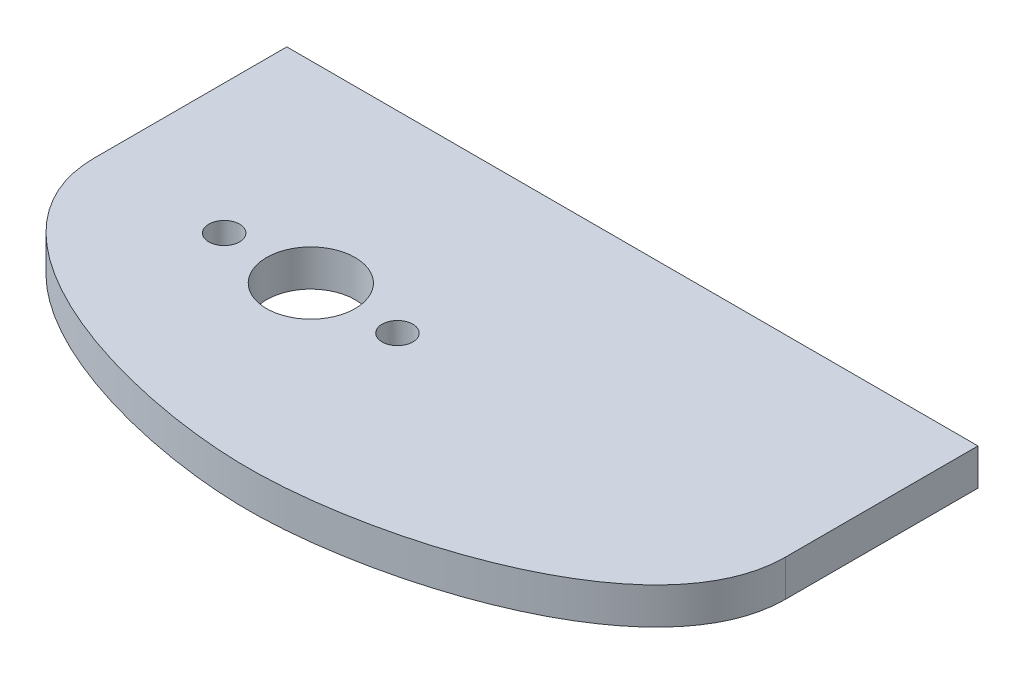
ISO-10303-21;
HEADER;
FILE_DESCRIPTION(('STEP AP214'),'2;1');
FILE_NAME('part.step','',(''),(''),'','','');
FILE_SCHEMA(('AUTOMOTIVE_DESIGN { 1 0 10303 214 1 1 1 1 }'));
ENDSEC;
DATA;
#1=APPLICATION_CONTEXT('core data for automotive mechanical design processes');
#2=APPLICATION_PROTOCOL_DEFINITION('international standard','automotive_design',2000,#1);
#3=PRODUCT_CONTEXT('',#1,'mechanical');
#4=PRODUCT('Part','Part','',(#3));
#5=PRODUCT_RELATED_PRODUCT_CATEGORY('part','',(#4));
#6=PRODUCT_DEFINITION_FORMATION('','',#4);
#7=PRODUCT_DEFINITION_CONTEXT('part definition',#1,'design');
#8=PRODUCT_DEFINITION('design','',#6,#7);
#9=PRODUCT_DEFINITION_SHAPE('','',#8);
#10=(LENGTH_UNIT() NAMED_UNIT(*) SI_UNIT(.MILLI.,.METRE.));
#11=(NAMED_UNIT(*) PLANE_ANGLE_UNIT() SI_UNIT($,.RADIAN.));
#12=(NAMED_UNIT(*) SI_UNIT($,.STERADIAN.) SOLID_ANGLE_UNIT());
#13=UNCERTAINTY_MEASURE_WITH_UNIT(LENGTH_MEASURE(1.E-05),#10,'distance_accuracy_value','');
#14=(GEOMETRIC_REPRESENTATION_CONTEXT(3) GLOBAL_UNCERTAINTY_ASSIGNED_CONTEXT((#13)) GLOBAL_UNIT_ASSIGNED_CONTEXT((#10,
#11,#12)) REPRESENTATION_CONTEXT('',''));
#15=CARTESIAN_POINT('',(0.,0.,0.));
#16=DIRECTION('',(0.,0.,1.));
#17=DIRECTION('',(1.,0.,0.));
#18=AXIS2_PLACEMENT_3D('',#15,#16,#17);
#19=CARTESIAN_POINT('',(-17.4968900599969,1.9,0.));
#20=DIRECTION('',(1.,0.,0.));
#21=DIRECTION('',(0.,0.,-1.));
#22=AXIS2_PLACEMENT_3D('',#19,#20,#21);
#23=PLANE('',#22);
#24=DIRECTION('',(0.,0.,1.));
#25=VECTOR('',#24,1.);
#26=CARTESIAN_POINT('',(-17.4968900599969,0.,0.));
#27=LINE('',#26,#25);
#28=CARTESIAN_POINT('',(-17.4968900599969,0.,-10.2267978635951));
#29=VERTEX_POINT('',#28);
#30=CARTESIAN_POINT('',(-17.4968900599969,0.,-0.226797863595054));
#31=VERTEX_POINT('',#30);
#32=EDGE_CURVE('E113',#29,#31,#27,.T.);
#33=ORIENTED_EDGE('',*,*,#32,.T.);
#34=DIRECTION('',(0.,-1.,0.));
#35=VECTOR('',#34,1.);
#36=CARTESIAN_POINT('',(-17.4968900599969,1.9,-0.226797863595054));
#37=LINE('',#36,#35);
#38=CARTESIAN_POINT('',(-17.4968900599969,1.9,-0.226797863595054));
#39=VERTEX_POINT('',#38);
#40=EDGE_CURVE('E11',#39,#31,#37,.T.);
#41=ORIENTED_EDGE('',*,*,#40,.F.);
#42=DIRECTION('',(0.,0.,1.));
#43=VECTOR('',#42,1.);
#44=CARTESIAN_POINT('',(-17.4968900599969,1.9,0.));
#45=LINE('',#44,#43);
#46=CARTESIAN_POINT('',(-17.4968900599969,1.9,-10.2267978635951));
#47=VERTEX_POINT('',#46);
#48=EDGE_CURVE('E86',#47,#39,#45,.T.);
#49=ORIENTED_EDGE('',*,*,#48,.F.);
#50=DIRECTION('',(0.,-1.,0.));
#51=VECTOR('',#50,1.);
#52=CARTESIAN_POINT('',(-17.4968900599969,1.9,-10.2267978635951));
#53=LINE('',#52,#51);
#54=EDGE_CURVE('E97',#47,#29,#53,.T.);
#55=ORIENTED_EDGE('',*,*,#54,.T.);
#56=EDGE_LOOP('',(#33,#41,#49,#55));
#57=FACE_BOUND('',#56,.T.);
#58=ADVANCED_FACE('F38',(#57),#23,.F.);
#59=CARTESIAN_POINT('',(-17.4968900599969,1.9,-0.226797863595054));
#60=CARTESIAN_POINT('',(-17.4968900599969,1.9,6.43986880307163));
#61=CARTESIAN_POINT('',(-6.21355672666352,1.9,9.72320213640494));
#62=CARTESIAN_POINT('',(7.11977660666981,1.9,9.72320213640494));
#63=CARTESIAN_POINT('',(18.4031099400037,1.9,6.43986880307182));
#64=CARTESIAN_POINT('',(18.4031099400031,1.9,-0.226797863595066));
#65=B_SPLINE_CURVE_WITH_KNOTS('',3,(#59,#60,#61,#62,#63,#64),.UNSPECIFIED.,.F.,.F.,(4,2,4),(0.,
0.5,1.),.UNSPECIFIED.);
#66=DIRECTION('',(0.,-1.,0.));
#67=VECTOR('',#66,1.);
#68=SURFACE_OF_LINEAR_EXTRUSION('',#65,#67);
#69=CARTESIAN_POINT('',(-17.4968900599969,0.,-0.226797863595054));
#70=CARTESIAN_POINT('',(-17.4968900599969,0.,6.43986880307163));
#71=CARTESIAN_POINT('',(-6.21355672666352,0.,9.72320213640494));
#72=CARTESIAN_POINT('',(7.11977660666981,0.,9.72320213640494));
#73=CARTESIAN_POINT('',(18.4031099400037,0.,6.43986880307182));
#74=CARTESIAN_POINT('',(18.4031099400031,0.,-0.226797863595066));
#75=B_SPLINE_CURVE_WITH_KNOTS('',3,(#69,#70,#71,#72,#73,#74),.UNSPECIFIED.,.F.,.F.,(4,2,4),(0.,
0.5,1.),.UNSPECIFIED.);
#76=CARTESIAN_POINT('',(18.4031099400031,0.,-0.226797863595066));
#77=VERTEX_POINT('',#76);
#78=EDGE_CURVE('E91',#31,#77,#75,.T.);
#79=ORIENTED_EDGE('',*,*,#78,.T.);
#80=DIRECTION('',(0.,-1.,0.));
#81=VECTOR('',#80,1.);
#82=CARTESIAN_POINT('',(18.4031099400031,1.9,-0.226797863595066));
#83=LINE('',#82,#81);
#84=CARTESIAN_POINT('',(18.4031099400031,1.9,-0.226797863595066));
#85=VERTEX_POINT('',#84);
#86=EDGE_CURVE('E47',#85,#77,#83,.T.);
#87=ORIENTED_EDGE('',*,*,#86,.F.);
#88=EDGE_CURVE('E81',#39,#85,#65,.T.);
#89=ORIENTED_EDGE('',*,*,#88,.F.);
#90=ORIENTED_EDGE('',*,*,#40,.T.);
#91=EDGE_LOOP('',(#79,#87,#89,#90));
#92=FACE_BOUND('',#91,.T.);
#93=ADVANCED_FACE('F90',(#92),#68,.F.);
#94=CARTESIAN_POINT('',(18.4031099400031,1.9,0.));
#95=DIRECTION('',(1.,0.,0.));
#96=DIRECTION('',(0.,0.,-1.));
#97=AXIS2_PLACEMENT_3D('',#94,#95,#96);
#98=PLANE('',#97);
#99=DIRECTION('',(0.,0.,1.));
#100=VECTOR('',#99,1.);
#101=CARTESIAN_POINT('',(18.4031099400031,0.,0.));
#102=LINE('',#101,#100);
#103=CARTESIAN_POINT('',(18.4031099400031,0.,-10.2267978635951));
#104=VERTEX_POINT('',#103);
#105=EDGE_CURVE('E119',#104,#77,#102,.T.);
#106=ORIENTED_EDGE('',*,*,#105,.F.);
#107=DIRECTION('',(0.,-1.,0.));
#108=VECTOR('',#107,1.);
#109=CARTESIAN_POINT('',(18.4031099400031,1.9,-10.2267978635951));
#110=LINE('',#109,#108);
#111=CARTESIAN_POINT('',(18.4031099400031,1.9,-10.2267978635951));
#112=VERTEX_POINT('',#111);
#113=EDGE_CURVE('E71',#112,#104,#110,.T.);
#114=ORIENTED_EDGE('',*,*,#113,.F.);
#115=DIRECTION('',(0.,0.,1.));
#116=VECTOR('',#115,1.);
#117=CARTESIAN_POINT('',(18.4031099400031,1.9,0.));
#118=LINE('',#117,#116);
#119=EDGE_CURVE('E84',#112,#85,#118,.T.);
#120=ORIENTED_EDGE('',*,*,#119,.T.);
#121=ORIENTED_EDGE('',*,*,#86,.T.);
#122=EDGE_LOOP('',(#106,#114,#120,#121));
#123=FACE_BOUND('',#122,.T.);
#124=ADVANCED_FACE('F95',(#123),#98,.T.);
#125=CARTESIAN_POINT('',(-6.25,1.9,-0.226797863595056));
#126=DIRECTION('',(0.,-1.,0.));
#127=DIRECTION('',(0.,0.,-1.));
#128=AXIS2_PLACEMENT_3D('',#125,#126,#127);
#129=CYLINDRICAL_SURFACE('',#128,2.3);
#130=CARTESIAN_POINT('',(-6.25,1.9,-0.226797863595056));
#131=DIRECTION('',(0.,1.,0.));
#132=DIRECTION('',(0.,0.,1.));
#133=AXIS2_PLACEMENT_3D('',#130,#131,#132);
#134=CIRCLE('',#133,2.3);
#135=CARTESIAN_POINT('',(-6.25,1.9,-2.52679786359506));
#136=VERTEX_POINT('',#135);
#137=EDGE_CURVE('E169',#136,#136,#134,.T.);
#138=CARTESIAN_POINT('',(-6.25,0.,-0.226797863595056));
#139=DIRECTION('',(0.,1.,0.));
#140=DIRECTION('',(0.,0.,1.));
#141=AXIS2_PLACEMENT_3D('',#138,#139,#140);
#142=CIRCLE('',#141,2.3);
#143=CARTESIAN_POINT('',(-6.25,0.,-2.52679786359506));
#144=VERTEX_POINT('',#143);
#145=EDGE_CURVE('E110',#144,#144,#142,.T.);
#146=CARTESIAN_POINT('',(-6.25,1.9,-2.52679786359506));
#147=CARTESIAN_POINT('',(-6.25,1.88020833333333,-2.52679786359506));
#148=CARTESIAN_POINT('',(-6.25,1.86041666666667,-2.52679786359506));
#149=CARTESIAN_POINT('',(-6.25,1.82083333333333,-2.52679786359506));
#150=CARTESIAN_POINT('',(-6.25,1.80104166666667,-2.52679786359506));
#151=CARTESIAN_POINT('',(-6.25,1.76145833333333,-2.52679786359506));
#152=CARTESIAN_POINT('',(-6.25,1.74166666666667,-2.52679786359506));
#153=CARTESIAN_POINT('',(-6.25,1.70208333333333,-2.52679786359506));
#154=CARTESIAN_POINT('',(-6.25,1.68229166666667,-2.52679786359506));
#155=CARTESIAN_POINT('',(-6.25,1.64270833333333,-2.52679786359506));
#156=CARTESIAN_POINT('',(-6.25,1.62291666666667,-2.52679786359506));
#157=CARTESIAN_POINT('',(-6.25,1.58333333333333,-2.52679786359506));
#158=CARTESIAN_POINT('',(-6.25,1.56354166666667,-2.52679786359506));
#159=CARTESIAN_POINT('',(-6.25,1.52395833333333,-2.52679786359506));
#160=CARTESIAN_POINT('',(-6.25,1.50416666666667,-2.52679786359506));
#161=CARTESIAN_POINT('',(-6.25,1.46458333333333,-2.52679786359506));
#162=CARTESIAN_POINT('',(-6.25,1.44479166666667,-2.52679786359506));
#163=CARTESIAN_POINT('',(-6.25,1.40520833333333,-2.52679786359506));
#164=CARTESIAN_POINT('',(-6.25,1.38541666666667,-2.52679786359506));
#165=CARTESIAN_POINT('',(-6.25,1.34583333333333,-2.52679786359506));
#166=CARTESIAN_POINT('',(-6.25,1.32604166666667,-2.52679786359506));
#167=CARTESIAN_POINT('',(-6.25,1.28645833333333,-2.52679786359506));
#168=CARTESIAN_POINT('',(-6.25,1.26666666666667,-2.52679786359506));
#169=CARTESIAN_POINT('',(-6.25,1.22708333333333,-2.52679786359506));
#170=CARTESIAN_POINT('',(-6.25,1.20729166666667,-2.52679786359506));
#171=CARTESIAN_POINT('',(-6.25,1.16770833333333,-2.52679786359506));
#172=CARTESIAN_POINT('',(-6.25,1.14791666666667,-2.52679786359506));
#173=CARTESIAN_POINT('',(-6.25,1.10833333333333,-2.52679786359506));
#174=CARTESIAN_POINT('',(-6.25,1.08854166666667,-2.52679786359506));
#175=CARTESIAN_POINT('',(-6.25,1.04895833333333,-2.52679786359506));
#176=CARTESIAN_POINT('',(-6.25,1.02916666666667,-2.52679786359506));
#177=CARTESIAN_POINT('',(-6.25,0.989583333333333,-2.52679786359506));
#178=CARTESIAN_POINT('',(-6.25,0.969791666666666,-2.52679786359506));
#179=CARTESIAN_POINT('',(-6.25,0.930208333333333,-2.52679786359506));
#180=CARTESIAN_POINT('',(-6.25,0.910416666666667,-2.52679786359506));
#181=CARTESIAN_POINT('',(-6.25,0.870833333333333,-2.52679786359506));
#182=CARTESIAN_POINT('',(-6.25,0.851041666666667,-2.52679786359506));
#183=CARTESIAN_POINT('',(-6.25,0.811458333333333,-2.52679786359506));
#184=CARTESIAN_POINT('',(-6.25,0.791666666666667,-2.52679786359506));
#185=CARTESIAN_POINT('',(-6.25,0.752083333333333,-2.52679786359506));
#186=CARTESIAN_POINT('',(-6.25,0.732291666666667,-2.52679786359506));
#187=CARTESIAN_POINT('',(-6.25,0.692708333333333,-2.52679786359506));
#188=CARTESIAN_POINT('',(-6.25,0.672916666666667,-2.52679786359506));
#189=CARTESIAN_POINT('',(-6.25,0.633333333333333,-2.52679786359506));
#190=CARTESIAN_POINT('',(-6.25,0.613541666666667,-2.52679786359506));
#191=CARTESIAN_POINT('',(-6.25,0.573958333333333,-2.52679786359506));
#192=CARTESIAN_POINT('',(-6.25,0.554166666666667,-2.52679786359506));
#193=CARTESIAN_POINT('',(-6.25,0.514583333333334,-2.52679786359506));
#194=CARTESIAN_POINT('',(-6.25,0.494791666666667,-2.52679786359506));
#195=CARTESIAN_POINT('',(-6.25,0.455208333333333,-2.52679786359506));
#196=CARTESIAN_POINT('',(-6.25,0.435416666666667,-2.52679786359506));
#197=CARTESIAN_POINT('',(-6.25,0.395833333333333,-2.52679786359506));
#198=CARTESIAN_POINT('',(-6.25,0.376041666666667,-2.52679786359506));
#199=CARTESIAN_POINT('',(-6.25,0.336458333333333,-2.52679786359506));
#200=CARTESIAN_POINT('',(-6.25,0.316666666666667,-2.52679786359506));
#201=CARTESIAN_POINT('',(-6.25,0.277083333333333,-2.52679786359506));
#202=CARTESIAN_POINT('',(-6.25,0.257291666666667,-2.52679786359506));
#203=CARTESIAN_POINT('',(-6.25,0.217708333333333,-2.52679786359506));
#204=CARTESIAN_POINT('',(-6.25,0.197916666666667,-2.52679786359506));
#205=CARTESIAN_POINT('',(-6.25,0.158333333333333,-2.52679786359506));
#206=CARTESIAN_POINT('',(-6.25,0.138541666666667,-2.52679786359506));
#207=CARTESIAN_POINT('',(-6.25,0.0989583333333333,-2.52679786359506));
#208=CARTESIAN_POINT('',(-6.25,0.0791666666666666,-2.52679786359506));
#209=CARTESIAN_POINT('',(-6.25,0.0395833333333333,-2.52679786359506));
#210=CARTESIAN_POINT('',(-6.25,0.0197916666666666,-2.52679786359506));
#211=CARTESIAN_POINT('',(-6.25,0.,-2.52679786359506));
#212=B_SPLINE_CURVE_WITH_KNOTS('',3,(#146,#147,#148,#149,#150,#151,#152,#153,#154,#155,#156,
#157,#158,#159,#160,#161,#162,#163,#164,#165,#166,#167,#168,#169,#170,#171,#172,#173,#174,#175,
#176,#177,#178,#179,#180,#181,#182,#183,#184,#185,#186,#187,#188,#189,#190,#191,#192,#193,#194,
#195,#196,#197,#198,#199,#200,#201,#202,#203,#204,#205,#206,#207,#208,#209,#210,#211),
.UNSPECIFIED.,.F.,.F.,(4,2,2,2,2,2,2,2,2,2,2,2,2,2,2,2,2,2,2,2,2,2,2,2,2,2,2,2,2,2,2,2,4),(0.,
0.0593750000000002,0.11875,0.178125,0.2375,0.296875,0.35625,0.415625,0.475,0.534375,0.59375,
0.653125,0.7125,0.771875,0.83125,0.890625,0.95,1.009375,1.06875,1.128125,1.1875,1.246875,
1.30625,1.365625,1.425,1.484375,1.54375,1.603125,1.6625,1.721875,1.78125,1.840625,1.9),.UNSPECIFIED.);
#213=EDGE_CURVE('BSEAM150',#136,#144,#212,.T.);
#214=ORIENTED_EDGE('',*,*,#137,.T.);
#215=ORIENTED_EDGE('',*,*,#145,.F.);
#216=ORIENTED_EDGE('',*,*,#213,.T.);
#217=ORIENTED_EDGE('',*,*,#213,.F.);
#218=EDGE_LOOP('',(#214,#216,#215,#217));
#219=FACE_BOUND('',#218,.T.);
#220=ADVANCED_FACE('F150',(#219),#129,.F.);
#221=CARTESIAN_POINT('',(-10.75,1.9,-0.226797863595056));
#222=DIRECTION('',(0.,-1.,0.));
#223=DIRECTION('',(0.,0.,-1.));
#224=AXIS2_PLACEMENT_3D('',#221,#222,#223);
#225=CYLINDRICAL_SURFACE('',#224,0.800000000000001);
#226=CARTESIAN_POINT('',(-10.75,1.9,-0.226797863595056));
#227=DIRECTION('',(0.,1.,0.));
#228=DIRECTION('',(0.,0.,1.));
#229=AXIS2_PLACEMENT_3D('',#226,#227,#228);
#230=CIRCLE('',#229,0.800000000000001);
#231=CARTESIAN_POINT('',(-10.75,1.9,-1.02679786359506));
#232=VERTEX_POINT('',#231);
#233=EDGE_CURVE('E163',#232,#232,#230,.T.);
#234=CARTESIAN_POINT('',(-10.75,0.,-0.226797863595056));
#235=DIRECTION('',(0.,1.,0.));
#236=DIRECTION('',(0.,0.,1.));
#237=AXIS2_PLACEMENT_3D('',#234,#235,#236);
#238=CIRCLE('',#237,0.800000000000001);
#239=CARTESIAN_POINT('',(-10.75,0.,-1.02679786359506));
#240=VERTEX_POINT('',#239);
#241=EDGE_CURVE('E107',#240,#240,#238,.T.);
#242=CARTESIAN_POINT('',(-10.75,1.9,-1.02679786359506));
#243=CARTESIAN_POINT('',(-10.75,1.88020833333333,-1.02679786359506));
#244=CARTESIAN_POINT('',(-10.75,1.86041666666667,-1.02679786359506));
#245=CARTESIAN_POINT('',(-10.75,1.82083333333333,-1.02679786359506));
#246=CARTESIAN_POINT('',(-10.75,1.80104166666667,-1.02679786359506));
#247=CARTESIAN_POINT('',(-10.75,1.76145833333333,-1.02679786359506));
#248=CARTESIAN_POINT('',(-10.75,1.74166666666667,-1.02679786359506));
#249=CARTESIAN_POINT('',(-10.75,1.70208333333333,-1.02679786359506));
#250=CARTESIAN_POINT('',(-10.75,1.68229166666667,-1.02679786359506));
#251=CARTESIAN_POINT('',(-10.75,1.64270833333333,-1.02679786359506));
#252=CARTESIAN_POINT('',(-10.75,1.62291666666667,-1.02679786359506));
#253=CARTESIAN_POINT('',(-10.75,1.58333333333333,-1.02679786359506));
#254=CARTESIAN_POINT('',(-10.75,1.56354166666667,-1.02679786359506));
#255=CARTESIAN_POINT('',(-10.75,1.52395833333333,-1.02679786359506));
#256=CARTESIAN_POINT('',(-10.75,1.50416666666667,-1.02679786359506));
#257=CARTESIAN_POINT('',(-10.75,1.46458333333333,-1.02679786359506));
#258=CARTESIAN_POINT('',(-10.75,1.44479166666667,-1.02679786359506));
#259=CARTESIAN_POINT('',(-10.75,1.40520833333333,-1.02679786359506));
#260=CARTESIAN_POINT('',(-10.75,1.38541666666667,-1.02679786359506));
#261=CARTESIAN_POINT('',(-10.75,1.34583333333333,-1.02679786359506));
#262=CARTESIAN_POINT('',(-10.75,1.32604166666667,-1.02679786359506));
#263=CARTESIAN_POINT('',(-10.75,1.28645833333333,-1.02679786359506));
#264=CARTESIAN_POINT('',(-10.75,1.26666666666667,-1.02679786359506));
#265=CARTESIAN_POINT('',(-10.75,1.22708333333333,-1.02679786359506));
#266=CARTESIAN_POINT('',(-10.75,1.20729166666667,-1.02679786359506));
#267=CARTESIAN_POINT('',(-10.75,1.16770833333333,-1.02679786359506));
#268=CARTESIAN_POINT('',(-10.75,1.14791666666667,-1.02679786359506));
#269=CARTESIAN_POINT('',(-10.75,1.10833333333333,-1.02679786359506));
#270=CARTESIAN_POINT('',(-10.75,1.08854166666667,-1.02679786359506));
#271=CARTESIAN_POINT('',(-10.75,1.04895833333333,-1.02679786359506));
#272=CARTESIAN_POINT('',(-10.75,1.02916666666667,-1.02679786359506));
#273=CARTESIAN_POINT('',(-10.75,0.989583333333333,-1.02679786359506));
#274=CARTESIAN_POINT('',(-10.75,0.969791666666666,-1.02679786359506));
#275=CARTESIAN_POINT('',(-10.75,0.930208333333333,-1.02679786359506));
#276=CARTESIAN_POINT('',(-10.75,0.910416666666667,-1.02679786359506));
#277=CARTESIAN_POINT('',(-10.75,0.870833333333333,-1.02679786359506));
#278=CARTESIAN_POINT('',(-10.75,0.851041666666667,-1.02679786359506));
#279=CARTESIAN_POINT('',(-10.75,0.811458333333333,-1.02679786359506));
#280=CARTESIAN_POINT('',(-10.75,0.791666666666667,-1.02679786359506));
#281=CARTESIAN_POINT('',(-10.75,0.752083333333333,-1.02679786359506));
#282=CARTESIAN_POINT('',(-10.75,0.732291666666667,-1.02679786359506));
#283=CARTESIAN_POINT('',(-10.75,0.692708333333333,-1.02679786359506));
#284=CARTESIAN_POINT('',(-10.75,0.672916666666667,-1.02679786359506));
#285=CARTESIAN_POINT('',(-10.75,0.633333333333333,-1.02679786359506));
#286=CARTESIAN_POINT('',(-10.75,0.613541666666667,-1.02679786359506));
#287=CARTESIAN_POINT('',(-10.75,0.573958333333333,-1.02679786359506));
#288=CARTESIAN_POINT('',(-10.75,0.554166666666667,-1.02679786359506));
#289=CARTESIAN_POINT('',(-10.75,0.514583333333334,-1.02679786359506));
#290=CARTESIAN_POINT('',(-10.75,0.494791666666667,-1.02679786359506));
#291=CARTESIAN_POINT('',(-10.75,0.455208333333333,-1.02679786359506));
#292=CARTESIAN_POINT('',(-10.75,0.435416666666667,-1.02679786359506));
#293=CARTESIAN_POINT('',(-10.75,0.395833333333333,-1.02679786359506));
#294=CARTESIAN_POINT('',(-10.75,0.376041666666667,-1.02679786359506));
#295=CARTESIAN_POINT('',(-10.75,0.336458333333333,-1.02679786359506));
#296=CARTESIAN_POINT('',(-10.75,0.316666666666667,-1.02679786359506));
#297=CARTESIAN_POINT('',(-10.75,0.277083333333333,-1.02679786359506));
#298=CARTESIAN_POINT('',(-10.75,0.257291666666667,-1.02679786359506));
#299=CARTESIAN_POINT('',(-10.75,0.217708333333333,-1.02679786359506));
#300=CARTESIAN_POINT('',(-10.75,0.197916666666667,-1.02679786359506));
#301=CARTESIAN_POINT('',(-10.75,0.158333333333333,-1.02679786359506));
#302=CARTESIAN_POINT('',(-10.75,0.138541666666667,-1.02679786359506));
#303=CARTESIAN_POINT('',(-10.75,0.0989583333333333,-1.02679786359506));
#304=CARTESIAN_POINT('',(-10.75,0.0791666666666666,-1.02679786359506));
#305=CARTESIAN_POINT('',(-10.75,0.0395833333333333,-1.02679786359506));
#306=CARTESIAN_POINT('',(-10.75,0.0197916666666666,-1.02679786359506));
#307=CARTESIAN_POINT('',(-10.75,0.,-1.02679786359506));
#308=B_SPLINE_CURVE_WITH_KNOTS('',3,(#242,#243,#244,#245,#246,#247,#248,#249,#250,#251,#252,
#253,#254,#255,#256,#257,#258,#259,#260,#261,#262,#263,#264,#265,#266,#267,#268,#269,#270,#271,
#272,#273,#274,#275,#276,#277,#278,#279,#280,#281,#282,#283,#284,#285,#286,#287,#288,#289,#290,
#291,#292,#293,#294,#295,#296,#297,#298,#299,#300,#301,#302,#303,#304,#305,#306,#307),
.UNSPECIFIED.,.F.,.F.,(4,2,2,2,2,2,2,2,2,2,2,2,2,2,2,2,2,2,2,2,2,2,2,2,2,2,2,2,2,2,2,2,4),(0.,
0.0593750000000002,0.11875,0.178125,0.2375,0.296875,0.35625,0.415625,0.475,0.534375,0.59375,
0.653125,0.7125,0.771875,0.83125,0.890625,0.95,1.009375,1.06875,1.128125,1.1875,1.246875,
1.30625,1.365625,1.425,1.484375,1.54375,1.603125,1.6625,1.721875,1.78125,1.840625,1.9),.UNSPECIFIED.);
#309=EDGE_CURVE('BSEAM152',#232,#240,#308,.T.);
#310=ORIENTED_EDGE('',*,*,#233,.T.);
#311=ORIENTED_EDGE('',*,*,#241,.F.);
#312=ORIENTED_EDGE('',*,*,#309,.T.);
#313=ORIENTED_EDGE('',*,*,#309,.F.);
#314=EDGE_LOOP('',(#310,#312,#311,#313));
#315=FACE_BOUND('',#314,.T.);
#316=ADVANCED_FACE('F152',(#315),#225,.F.);
#317=CARTESIAN_POINT('',(-1.75,1.9,-0.226797863595057));
#318=DIRECTION('',(0.,-1.,0.));
#319=DIRECTION('',(0.,0.,-1.));
#320=AXIS2_PLACEMENT_3D('',#317,#318,#319);
#321=CYLINDRICAL_SURFACE('',#320,0.8);
#322=CARTESIAN_POINT('',(-1.75,1.9,-0.226797863595057));
#323=DIRECTION('',(0.,1.,0.));
#324=DIRECTION('',(0.,0.,1.));
#325=AXIS2_PLACEMENT_3D('',#322,#323,#324);
#326=CIRCLE('',#325,0.8);
#327=CARTESIAN_POINT('',(-1.75,1.9,-1.02679786359506));
#328=VERTEX_POINT('',#327);
#329=EDGE_CURVE('E125',#328,#328,#326,.T.);
#330=CARTESIAN_POINT('',(-1.75,0.,-0.226797863595057));
#331=DIRECTION('',(0.,1.,0.));
#332=DIRECTION('',(0.,0.,1.));
#333=AXIS2_PLACEMENT_3D('',#330,#331,#332);
#334=CIRCLE('',#333,0.8);
#335=CARTESIAN_POINT('',(-1.75,0.,-1.02679786359506));
#336=VERTEX_POINT('',#335);
#337=EDGE_CURVE('E104',#336,#336,#334,.T.);
#338=CARTESIAN_POINT('',(-1.75,1.9,-1.02679786359506));
#339=CARTESIAN_POINT('',(-1.75,1.88020833333333,-1.02679786359506));
#340=CARTESIAN_POINT('',(-1.75,1.86041666666667,-1.02679786359506));
#341=CARTESIAN_POINT('',(-1.75,1.82083333333333,-1.02679786359506));
#342=CARTESIAN_POINT('',(-1.75,1.80104166666667,-1.02679786359506));
#343=CARTESIAN_POINT('',(-1.75,1.76145833333333,-1.02679786359506));
#344=CARTESIAN_POINT('',(-1.75,1.74166666666667,-1.02679786359506));
#345=CARTESIAN_POINT('',(-1.75,1.70208333333333,-1.02679786359506));
#346=CARTESIAN_POINT('',(-1.75,1.68229166666667,-1.02679786359506));
#347=CARTESIAN_POINT('',(-1.75,1.64270833333333,-1.02679786359506));
#348=CARTESIAN_POINT('',(-1.75,1.62291666666667,-1.02679786359506));
#349=CARTESIAN_POINT('',(-1.75,1.58333333333333,-1.02679786359506));
#350=CARTESIAN_POINT('',(-1.75,1.56354166666667,-1.02679786359506));
#351=CARTESIAN_POINT('',(-1.75,1.52395833333333,-1.02679786359506));
#352=CARTESIAN_POINT('',(-1.75,1.50416666666667,-1.02679786359506));
#353=CARTESIAN_POINT('',(-1.75,1.46458333333333,-1.02679786359506));
#354=CARTESIAN_POINT('',(-1.75,1.44479166666667,-1.02679786359506));
#355=CARTESIAN_POINT('',(-1.75,1.40520833333333,-1.02679786359506));
#356=CARTESIAN_POINT('',(-1.75,1.38541666666667,-1.02679786359506));
#357=CARTESIAN_POINT('',(-1.75,1.34583333333333,-1.02679786359506));
#358=CARTESIAN_POINT('',(-1.75,1.32604166666667,-1.02679786359506));
#359=CARTESIAN_POINT('',(-1.75,1.28645833333333,-1.02679786359506));
#360=CARTESIAN_POINT('',(-1.75,1.26666666666667,-1.02679786359506));
#361=CARTESIAN_POINT('',(-1.75,1.22708333333333,-1.02679786359506));
#362=CARTESIAN_POINT('',(-1.75,1.20729166666667,-1.02679786359506));
#363=CARTESIAN_POINT('',(-1.75,1.16770833333333,-1.02679786359506));
#364=CARTESIAN_POINT('',(-1.75,1.14791666666667,-1.02679786359506));
#365=CARTESIAN_POINT('',(-1.75,1.10833333333333,-1.02679786359506));
#366=CARTESIAN_POINT('',(-1.75,1.08854166666667,-1.02679786359506));
#367=CARTESIAN_POINT('',(-1.75,1.04895833333333,-1.02679786359506));
#368=CARTESIAN_POINT('',(-1.75,1.02916666666667,-1.02679786359506));
#369=CARTESIAN_POINT('',(-1.75,0.989583333333333,-1.02679786359506));
#370=CARTESIAN_POINT('',(-1.75,0.969791666666666,-1.02679786359506));
#371=CARTESIAN_POINT('',(-1.75,0.930208333333333,-1.02679786359506));
#372=CARTESIAN_POINT('',(-1.75,0.910416666666667,-1.02679786359506));
#373=CARTESIAN_POINT('',(-1.75,0.870833333333333,-1.02679786359506));
#374=CARTESIAN_POINT('',(-1.75,0.851041666666667,-1.02679786359506));
#375=CARTESIAN_POINT('',(-1.75,0.811458333333333,-1.02679786359506));
#376=CARTESIAN_POINT('',(-1.75,0.791666666666667,-1.02679786359506));
#377=CARTESIAN_POINT('',(-1.75,0.752083333333333,-1.02679786359506));
#378=CARTESIAN_POINT('',(-1.75,0.732291666666667,-1.02679786359506));
#379=CARTESIAN_POINT('',(-1.75,0.692708333333333,-1.02679786359506));
#380=CARTESIAN_POINT('',(-1.75,0.672916666666667,-1.02679786359506));
#381=CARTESIAN_POINT('',(-1.75,0.633333333333333,-1.02679786359506));
#382=CARTESIAN_POINT('',(-1.75,0.613541666666667,-1.02679786359506));
#383=CARTESIAN_POINT('',(-1.75,0.573958333333333,-1.02679786359506));
#384=CARTESIAN_POINT('',(-1.75,0.554166666666667,-1.02679786359506));
#385=CARTESIAN_POINT('',(-1.75,0.514583333333334,-1.02679786359506));
#386=CARTESIAN_POINT('',(-1.75,0.494791666666667,-1.02679786359506));
#387=CARTESIAN_POINT('',(-1.75,0.455208333333333,-1.02679786359506));
#388=CARTESIAN_POINT('',(-1.75,0.435416666666667,-1.02679786359506));
#389=CARTESIAN_POINT('',(-1.75,0.395833333333333,-1.02679786359506));
#390=CARTESIAN_POINT('',(-1.75,0.376041666666667,-1.02679786359506));
#391=CARTESIAN_POINT('',(-1.75,0.336458333333333,-1.02679786359506));
#392=CARTESIAN_POINT('',(-1.75,0.316666666666667,-1.02679786359506));
#393=CARTESIAN_POINT('',(-1.75,0.277083333333333,-1.02679786359506));
#394=CARTESIAN_POINT('',(-1.75,0.257291666666667,-1.02679786359506));
#395=CARTESIAN_POINT('',(-1.75,0.217708333333333,-1.02679786359506));
#396=CARTESIAN_POINT('',(-1.75,0.197916666666667,-1.02679786359506));
#397=CARTESIAN_POINT('',(-1.75,0.158333333333333,-1.02679786359506));
#398=CARTESIAN_POINT('',(-1.75,0.138541666666667,-1.02679786359506));
#399=CARTESIAN_POINT('',(-1.75,0.0989583333333333,-1.02679786359506));
#400=CARTESIAN_POINT('',(-1.75,0.0791666666666666,-1.02679786359506));
#401=CARTESIAN_POINT('',(-1.75,0.0395833333333333,-1.02679786359506));
#402=CARTESIAN_POINT('',(-1.75,0.0197916666666666,-1.02679786359506));
#403=CARTESIAN_POINT('',(-1.75,0.,-1.02679786359506));
#404=B_SPLINE_CURVE_WITH_KNOTS('',3,(#338,#339,#340,#341,#342,#343,#344,#345,#346,#347,#348,
#349,#350,#351,#352,#353,#354,#355,#356,#357,#358,#359,#360,#361,#362,#363,#364,#365,#366,#367,
#368,#369,#370,#371,#372,#373,#374,#375,#376,#377,#378,#379,#380,#381,#382,#383,#384,#385,#386,
#387,#388,#389,#390,#391,#392,#393,#394,#395,#396,#397,#398,#399,#400,#401,#402,#403),
.UNSPECIFIED.,.F.,.F.,(4,2,2,2,2,2,2,2,2,2,2,2,2,2,2,2,2,2,2,2,2,2,2,2,2,2,2,2,2,2,2,2,4),(0.,
0.0593750000000002,0.11875,0.178125,0.2375,0.296875,0.35625,0.415625,0.475,0.534375,0.59375,
0.653125,0.7125,0.771875,0.83125,0.890625,0.95,1.009375,1.06875,1.128125,1.1875,1.246875,
1.30625,1.365625,1.425,1.484375,1.54375,1.603125,1.6625,1.721875,1.78125,1.840625,1.9),.UNSPECIFIED.);
#405=EDGE_CURVE('BSEAM40',#328,#336,#404,.T.);
#406=ORIENTED_EDGE('',*,*,#329,.T.);
#407=ORIENTED_EDGE('',*,*,#337,.F.);
#408=ORIENTED_EDGE('',*,*,#405,.T.);
#409=ORIENTED_EDGE('',*,*,#405,.F.);
#410=EDGE_LOOP('',(#406,#408,#407,#409));
#411=FACE_BOUND('',#410,.T.);
#412=ADVANCED_FACE('F40',(#411),#321,.F.);
#413=CARTESIAN_POINT('',(0.,1.9,-10.2267978635951));
#414=DIRECTION('',(0.,0.,1.));
#415=DIRECTION('',(1.,0.,0.));
#416=AXIS2_PLACEMENT_3D('',#413,#414,#415);
#417=PLANE('',#416);
#418=DIRECTION('',(-1.,0.,0.));
#419=VECTOR('',#418,1.);
#420=CARTESIAN_POINT('',(0.,0.,-10.2267978635951));
#421=LINE('',#420,#419);
#422=EDGE_CURVE('E74',#104,#29,#421,.T.);
#423=ORIENTED_EDGE('',*,*,#422,.T.);
#424=ORIENTED_EDGE('',*,*,#54,.F.);
#425=DIRECTION('',(-1.,0.,0.));
#426=VECTOR('',#425,1.);
#427=CARTESIAN_POINT('',(0.,1.9,-10.2267978635951));
#428=LINE('',#427,#426);
#429=EDGE_CURVE('E55',#112,#47,#428,.T.);
#430=ORIENTED_EDGE('',*,*,#429,.F.);
#431=ORIENTED_EDGE('',*,*,#113,.T.);
#432=EDGE_LOOP('',(#423,#424,#430,#431));
#433=FACE_BOUND('',#432,.T.);
#434=ADVANCED_FACE('F137',(#433),#417,.F.);
#435=CARTESIAN_POINT('',(0.,1.9,0.));
#436=DIRECTION('',(0.,1.,0.));
#437=DIRECTION('',(0.,0.,1.));
#438=AXIS2_PLACEMENT_3D('',#435,#436,#437);
#439=PLANE('',#438);
#440=ORIENTED_EDGE('',*,*,#329,.F.);
#441=EDGE_LOOP('',(#440));
#442=FACE_BOUND('',#441,.T.);
#443=ORIENTED_EDGE('',*,*,#233,.F.);
#444=EDGE_LOOP('',(#443));
#445=FACE_BOUND('',#444,.T.);
#446=ORIENTED_EDGE('',*,*,#137,.F.);
#447=EDGE_LOOP('',(#446));
#448=FACE_BOUND('',#447,.T.);
#449=ORIENTED_EDGE('',*,*,#48,.T.);
#450=ORIENTED_EDGE('',*,*,#88,.T.);
#451=ORIENTED_EDGE('',*,*,#119,.F.);
#452=ORIENTED_EDGE('',*,*,#429,.T.);
#453=EDGE_LOOP('',(#449,#450,#451,#452));
#454=FACE_BOUND('',#453,.T.);
#455=ADVANCED_FACE('F82',(#442,#445,#448,#454),#439,.T.);
#456=CARTESIAN_POINT('',(0.,0.,0.));
#457=DIRECTION('',(0.,1.,0.));
#458=DIRECTION('',(0.,0.,1.));
#459=AXIS2_PLACEMENT_3D('',#456,#457,#458);
#460=PLANE('',#459);
#461=ORIENTED_EDGE('',*,*,#337,.T.);
#462=EDGE_LOOP('',(#461));
#463=FACE_BOUND('',#462,.T.);
#464=ORIENTED_EDGE('',*,*,#241,.T.);
#465=EDGE_LOOP('',(#464));
#466=FACE_BOUND('',#465,.T.);
#467=ORIENTED_EDGE('',*,*,#145,.T.);
#468=EDGE_LOOP('',(#467));
#469=FACE_BOUND('',#468,.T.);
#470=ORIENTED_EDGE('',*,*,#32,.F.);
#471=ORIENTED_EDGE('',*,*,#422,.F.);
#472=ORIENTED_EDGE('',*,*,#105,.T.);
#473=ORIENTED_EDGE('',*,*,#78,.F.);
#474=EDGE_LOOP('',(#470,#471,#472,#473));
#475=FACE_BOUND('',#474,.T.);
#476=ADVANCED_FACE('F130',(#463,#466,#469,#475),#460,.F.);
#477=CLOSED_SHELL('',(#58,#93,#124,#220,#316,#412,#434,#455,#476));
#478=MANIFOLD_SOLID_BREP('B2',#477);
#479=ADVANCED_BREP_SHAPE_REPRESENTATION('',(#18,#478),#14);
#480=SHAPE_DEFINITION_REPRESENTATION(#9,#479);
ENDSEC;
END-ISO-10303-21;
